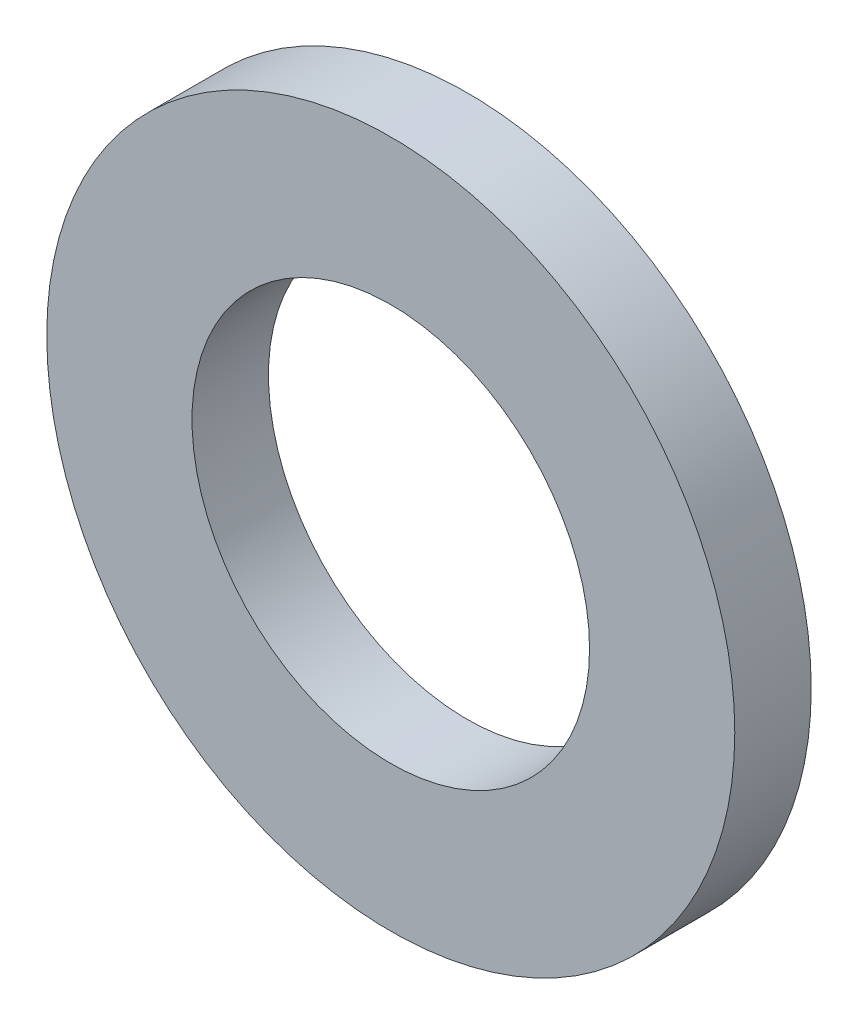
ISO-10303-21;
HEADER;
FILE_DESCRIPTION(('STEP AP214'),'2;1');
FILE_NAME('part.step','',(''),(''),'','','');
FILE_SCHEMA(('AUTOMOTIVE_DESIGN { 1 0 10303 214 1 1 1 1 }'));
ENDSEC;
DATA;
#1=APPLICATION_CONTEXT('core data for automotive mechanical design processes');
#2=APPLICATION_PROTOCOL_DEFINITION('international standard','automotive_design',2000,#1);
#3=PRODUCT_CONTEXT('',#1,'mechanical');
#4=PRODUCT('Part','Part','',(#3));
#5=PRODUCT_RELATED_PRODUCT_CATEGORY('part','',(#4));
#6=PRODUCT_DEFINITION_FORMATION('','',#4);
#7=PRODUCT_DEFINITION_CONTEXT('part definition',#1,'design');
#8=PRODUCT_DEFINITION('design','',#6,#7);
#9=PRODUCT_DEFINITION_SHAPE('','',#8);
#10=(LENGTH_UNIT() NAMED_UNIT(*) SI_UNIT(.MILLI.,.METRE.));
#11=(NAMED_UNIT(*) PLANE_ANGLE_UNIT() SI_UNIT($,.RADIAN.));
#12=(NAMED_UNIT(*) SI_UNIT($,.STERADIAN.) SOLID_ANGLE_UNIT());
#13=UNCERTAINTY_MEASURE_WITH_UNIT(LENGTH_MEASURE(1.E-05),#10,'distance_accuracy_value','');
#14=(GEOMETRIC_REPRESENTATION_CONTEXT(3) GLOBAL_UNCERTAINTY_ASSIGNED_CONTEXT((#13)) GLOBAL_UNIT_ASSIGNED_CONTEXT((#10,
#11,#12)) REPRESENTATION_CONTEXT('',''));
#15=CARTESIAN_POINT('',(0.,0.,0.));
#16=DIRECTION('',(0.,0.,1.));
#17=DIRECTION('',(1.,0.,0.));
#18=AXIS2_PLACEMENT_3D('',#15,#16,#17);
#19=CARTESIAN_POINT('',(0.,0.,0.));
#20=DIRECTION('',(0.,0.,1.));
#21=DIRECTION('',(1.,0.,0.));
#22=AXIS2_PLACEMENT_3D('',#19,#20,#21);
#23=PLANE('',#22);
#24=CARTESIAN_POINT('',(0.,0.,0.));
#25=DIRECTION('',(0.,0.,-1.));
#26=DIRECTION('',(1.,0.,0.));
#27=AXIS2_PLACEMENT_3D('',#24,#25,#26);
#28=CIRCLE('',#27,2.6);
#29=CARTESIAN_POINT('',(2.6,0.,0.));
#30=VERTEX_POINT('',#29);
#31=EDGE_CURVE('E11',#30,#30,#28,.T.);
#32=ORIENTED_EDGE('',*,*,#31,.F.);
#33=EDGE_LOOP('',(#32));
#34=FACE_BOUND('',#33,.T.);
#35=CARTESIAN_POINT('',(0.,0.,0.));
#36=DIRECTION('',(0.,0.,1.));
#37=DIRECTION('',(1.,0.,0.));
#38=AXIS2_PLACEMENT_3D('',#35,#36,#37);
#39=CIRCLE('',#38,4.5);
#40=CARTESIAN_POINT('',(4.5,0.,0.));
#41=VERTEX_POINT('',#40);
#42=EDGE_CURVE('E19',#41,#41,#39,.T.);
#43=ORIENTED_EDGE('',*,*,#42,.F.);
#44=EDGE_LOOP('',(#43));
#45=FACE_BOUND('',#44,.T.);
#46=ADVANCED_FACE('F16',(#34,#45),#23,.F.);
#47=CARTESIAN_POINT('',(0.,0.,1.));
#48=DIRECTION('',(0.,0.,1.));
#49=DIRECTION('',(1.,0.,0.));
#50=AXIS2_PLACEMENT_3D('',#47,#48,#49);
#51=PLANE('',#50);
#52=CARTESIAN_POINT('',(0.,0.,1.));
#53=DIRECTION('',(0.,0.,-1.));
#54=DIRECTION('',(1.,0.,0.));
#55=AXIS2_PLACEMENT_3D('',#52,#53,#54);
#56=CIRCLE('',#55,2.6);
#57=CARTESIAN_POINT('',(2.6,0.,1.));
#58=VERTEX_POINT('',#57);
#59=EDGE_CURVE('E26',#58,#58,#56,.T.);
#60=ORIENTED_EDGE('',*,*,#59,.T.);
#61=EDGE_LOOP('',(#60));
#62=FACE_BOUND('',#61,.T.);
#63=CARTESIAN_POINT('',(0.,0.,1.));
#64=DIRECTION('',(0.,0.,1.));
#65=DIRECTION('',(1.,0.,0.));
#66=AXIS2_PLACEMENT_3D('',#63,#64,#65);
#67=CIRCLE('',#66,4.5);
#68=CARTESIAN_POINT('',(4.5,0.,1.));
#69=VERTEX_POINT('',#68);
#70=EDGE_CURVE('E51',#69,#69,#67,.T.);
#71=ORIENTED_EDGE('',*,*,#70,.T.);
#72=EDGE_LOOP('',(#71));
#73=FACE_BOUND('',#72,.T.);
#74=ADVANCED_FACE('F52',(#62,#73),#51,.T.);
#75=CARTESIAN_POINT('',(0.,0.,1.));
#76=DIRECTION('',(0.,0.,-1.));
#77=DIRECTION('',(-1.,0.,0.));
#78=AXIS2_PLACEMENT_3D('',#75,#76,#77);
#79=CYLINDRICAL_SURFACE('',#78,2.6);
#80=ORIENTED_EDGE('',*,*,#31,.T.);
#81=EDGE_LOOP('',(#80));
#82=FACE_BOUND('',#81,.T.);
#83=ORIENTED_EDGE('',*,*,#59,.F.);
#84=EDGE_LOOP('',(#83));
#85=FACE_BOUND('',#84,.T.);
#86=ADVANCED_FACE('F66',(#82,#85),#79,.F.);
#87=CARTESIAN_POINT('',(0.,0.,1.));
#88=DIRECTION('',(0.,0.,-1.));
#89=DIRECTION('',(-1.,0.,0.));
#90=AXIS2_PLACEMENT_3D('',#87,#88,#89);
#91=CYLINDRICAL_SURFACE('',#90,4.5);
#92=ORIENTED_EDGE('',*,*,#42,.T.);
#93=EDGE_LOOP('',(#92));
#94=FACE_BOUND('',#93,.T.);
#95=ORIENTED_EDGE('',*,*,#70,.F.);
#96=EDGE_LOOP('',(#95));
#97=FACE_BOUND('',#96,.T.);
#98=ADVANCED_FACE('F68',(#94,#97),#91,.T.);
#99=CLOSED_SHELL('',(#46,#74,#86,#98));
#100=MANIFOLD_SOLID_BREP('B1',#99);
#101=ADVANCED_BREP_SHAPE_REPRESENTATION('',(#18,#100),#14);
#102=SHAPE_DEFINITION_REPRESENTATION(#9,#101);
ENDSEC;
END-ISO-10303-21;
